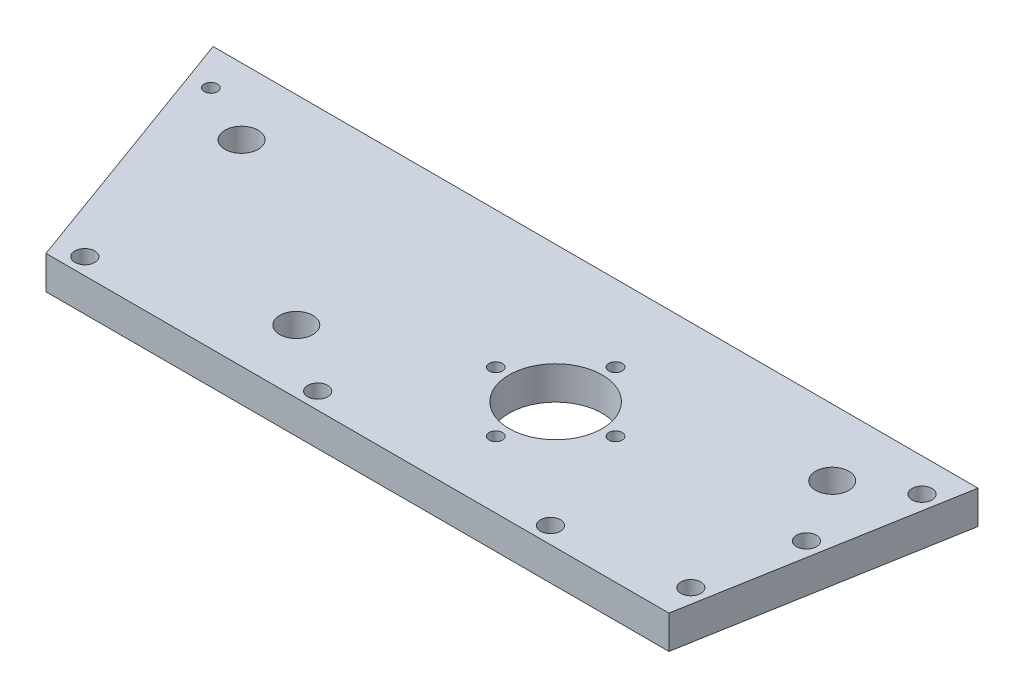
ISO-10303-21;
HEADER;
FILE_DESCRIPTION(('STEP AP214'),'2;1');
FILE_NAME('part.step','',(''),(''),'','','');
FILE_SCHEMA(('AUTOMOTIVE_DESIGN { 1 0 10303 214 1 1 1 1 }'));
ENDSEC;
DATA;
#1=APPLICATION_CONTEXT('core data for automotive mechanical design processes');
#2=APPLICATION_PROTOCOL_DEFINITION('international standard','automotive_design',2000,#1);
#3=PRODUCT_CONTEXT('',#1,'mechanical');
#4=PRODUCT('Part','Part','',(#3));
#5=PRODUCT_RELATED_PRODUCT_CATEGORY('part','',(#4));
#6=PRODUCT_DEFINITION_FORMATION('','',#4);
#7=PRODUCT_DEFINITION_CONTEXT('part definition',#1,'design');
#8=PRODUCT_DEFINITION('design','',#6,#7);
#9=PRODUCT_DEFINITION_SHAPE('','',#8);
#10=(LENGTH_UNIT() NAMED_UNIT(*) SI_UNIT(.MILLI.,.METRE.));
#11=(NAMED_UNIT(*) PLANE_ANGLE_UNIT() SI_UNIT($,.RADIAN.));
#12=(NAMED_UNIT(*) SI_UNIT($,.STERADIAN.) SOLID_ANGLE_UNIT());
#13=UNCERTAINTY_MEASURE_WITH_UNIT(LENGTH_MEASURE(1.E-05),#10,'distance_accuracy_value','');
#14=(GEOMETRIC_REPRESENTATION_CONTEXT(3) GLOBAL_UNCERTAINTY_ASSIGNED_CONTEXT((#13)) GLOBAL_UNIT_ASSIGNED_CONTEXT((#10,
#11,#12)) REPRESENTATION_CONTEXT('',''));
#15=CARTESIAN_POINT('',(0.,0.,0.));
#16=DIRECTION('',(0.,0.,1.));
#17=DIRECTION('',(1.,0.,0.));
#18=AXIS2_PLACEMENT_3D('',#15,#16,#17);
#19=CARTESIAN_POINT('',(0.,5.,-13.));
#20=DIRECTION('',(0.,0.,-1.));
#21=DIRECTION('',(-1.,0.,0.));
#22=AXIS2_PLACEMENT_3D('',#19,#20,#21);
#23=PLANE('',#22);
#24=DIRECTION('',(1.,0.,0.));
#25=VECTOR('',#24,1.);
#26=CARTESIAN_POINT('',(0.,0.,-13.));
#27=LINE('',#26,#25);
#28=CARTESIAN_POINT('',(-28.1321221673295,0.,-13.));
#29=VERTEX_POINT('',#28);
#30=CARTESIAN_POINT('',(65.5261378411708,0.,-13.));
#31=VERTEX_POINT('',#30);
#32=EDGE_CURVE('E114',#29,#31,#27,.T.);
#33=ORIENTED_EDGE('',*,*,#32,.T.);
#34=DIRECTION('',(0.,-1.,0.));
#35=VECTOR('',#34,1.);
#36=CARTESIAN_POINT('',(65.5261378411708,5.,-13.));
#37=LINE('',#36,#35);
#38=CARTESIAN_POINT('',(65.5261378411708,5.,-13.));
#39=VERTEX_POINT('',#38);
#40=EDGE_CURVE('E11',#39,#31,#37,.T.);
#41=ORIENTED_EDGE('',*,*,#40,.F.);
#42=DIRECTION('',(1.,0.,0.));
#43=VECTOR('',#42,1.);
#44=CARTESIAN_POINT('',(0.,5.,-13.));
#45=LINE('',#44,#43);
#46=CARTESIAN_POINT('',(-28.1321221673295,5.,-13.));
#47=VERTEX_POINT('',#46);
#48=EDGE_CURVE('E98',#47,#39,#45,.T.);
#49=ORIENTED_EDGE('',*,*,#48,.F.);
#50=DIRECTION('',(0.,-1.,0.));
#51=VECTOR('',#50,1.);
#52=CARTESIAN_POINT('',(-28.1321221673295,5.,-13.));
#53=LINE('',#52,#51);
#54=EDGE_CURVE('E110',#47,#29,#53,.T.);
#55=ORIENTED_EDGE('',*,*,#54,.T.);
#56=EDGE_LOOP('',(#33,#41,#49,#55));
#57=FACE_BOUND('',#56,.T.);
#58=ADVANCED_FACE('F46',(#57),#23,.F.);
#59=CARTESIAN_POINT('',(61.3271520879427,5.,10.813631563116));
#60=DIRECTION('',(-0.984807753012207,0.,-0.173648177666934));
#61=DIRECTION('',(-0.173648177666934,0.,0.984807753012207));
#62=AXIS2_PLACEMENT_3D('',#59,#60,#61);
#63=PLANE('',#62);
#64=DIRECTION('',(0.173648177666935,0.,-0.984807753012207));
#65=VECTOR('',#64,1.);
#66=CARTESIAN_POINT('',(61.3271520879427,0.,10.813631563116));
#67=LINE('',#66,#65);
#68=CARTESIAN_POINT('',(72.4910535791554,0.,-52.5));
#69=VERTEX_POINT('',#68);
#70=EDGE_CURVE('E103',#31,#69,#67,.T.);
#71=ORIENTED_EDGE('',*,*,#70,.T.);
#72=DIRECTION('',(0.,-1.,0.));
#73=VECTOR('',#72,1.);
#74=CARTESIAN_POINT('',(72.4910535791554,5.,-52.5));
#75=LINE('',#74,#73);
#76=CARTESIAN_POINT('',(72.4910535791554,5.,-52.5));
#77=VERTEX_POINT('',#76);
#78=EDGE_CURVE('E55',#77,#69,#75,.T.);
#79=ORIENTED_EDGE('',*,*,#78,.F.);
#80=DIRECTION('',(0.173648177666935,0.,-0.984807753012207));
#81=VECTOR('',#80,1.);
#82=CARTESIAN_POINT('',(61.3271520879427,5.,10.813631563116));
#83=LINE('',#82,#81);
#84=EDGE_CURVE('E93',#39,#77,#83,.T.);
#85=ORIENTED_EDGE('',*,*,#84,.F.);
#86=ORIENTED_EDGE('',*,*,#40,.T.);
#87=EDGE_LOOP('',(#71,#79,#85,#86));
#88=FACE_BOUND('',#87,.T.);
#89=ADVANCED_FACE('F102',(#88),#63,.F.);
#90=CARTESIAN_POINT('',(0.,5.,-52.5));
#91=DIRECTION('',(0.,0.,1.));
#92=DIRECTION('',(1.,0.,0.));
#93=AXIS2_PLACEMENT_3D('',#90,#91,#92);
#94=PLANE('',#93);
#95=DIRECTION('',(-1.,0.,0.));
#96=VECTOR('',#95,1.);
#97=CARTESIAN_POINT('',(0.,0.,-52.5));
#98=LINE('',#97,#96);
#99=CARTESIAN_POINT('',(-42.5089464208447,0.,-52.5));
#100=VERTEX_POINT('',#99);
#101=EDGE_CURVE('E80',#69,#100,#98,.T.);
#102=ORIENTED_EDGE('',*,*,#101,.T.);
#103=DIRECTION('',(0.,-1.,0.));
#104=VECTOR('',#103,1.);
#105=CARTESIAN_POINT('',(-42.5089464208447,5.,-52.5));
#106=LINE('',#105,#104);
#107=CARTESIAN_POINT('',(-42.5089464208447,5.,-52.5));
#108=VERTEX_POINT('',#107);
#109=EDGE_CURVE('E105',#108,#100,#106,.T.);
#110=ORIENTED_EDGE('',*,*,#109,.F.);
#111=DIRECTION('',(-1.,0.,0.));
#112=VECTOR('',#111,1.);
#113=CARTESIAN_POINT('',(0.,5.,-52.5));
#114=LINE('',#113,#112);
#115=EDGE_CURVE('E96',#77,#108,#114,.T.);
#116=ORIENTED_EDGE('',*,*,#115,.F.);
#117=ORIENTED_EDGE('',*,*,#78,.T.);
#118=EDGE_LOOP('',(#102,#110,#116,#117));
#119=FACE_BOUND('',#118,.T.);
#120=ADVANCED_FACE('F106',(#119),#94,.F.);
#121=CARTESIAN_POINT('',(-20.6631695504156,5.,7.52077866194712));
#122=DIRECTION('',(0.939692620785907,0.,-0.342020143325673));
#123=DIRECTION('',(-0.342020143325673,0.,-0.939692620785907));
#124=AXIS2_PLACEMENT_3D('',#121,#122,#123);
#125=PLANE('',#124);
#126=DIRECTION('',(0.342020143325673,0.,0.939692620785907));
#127=VECTOR('',#126,1.);
#128=CARTESIAN_POINT('',(-20.6631695504156,0.,7.52077866194712));
#129=LINE('',#128,#127);
#130=EDGE_CURVE('E86',#100,#29,#129,.T.);
#131=ORIENTED_EDGE('',*,*,#130,.T.);
#132=ORIENTED_EDGE('',*,*,#54,.F.);
#133=DIRECTION('',(0.342020143325673,0.,0.939692620785907));
#134=VECTOR('',#133,1.);
#135=CARTESIAN_POINT('',(-20.6631695504156,5.,7.52077866194712));
#136=LINE('',#135,#134);
#137=EDGE_CURVE('E63',#108,#47,#136,.T.);
#138=ORIENTED_EDGE('',*,*,#137,.F.);
#139=ORIENTED_EDGE('',*,*,#109,.T.);
#140=EDGE_LOOP('',(#131,#132,#138,#139));
#141=FACE_BOUND('',#140,.T.);
#142=ADVANCED_FACE('F128',(#141),#125,.F.);
#143=CARTESIAN_POINT('',(0.,5.,0.));
#144=DIRECTION('',(0.,1.,0.));
#145=DIRECTION('',(0.,0.,1.));
#146=AXIS2_PLACEMENT_3D('',#143,#144,#145);
#147=PLANE('',#146);
#148=CARTESIAN_POINT('',(-37.2957275552078,5.,-46.9482120844756));
#149=DIRECTION('',(0.,1.,0.));
#150=DIRECTION('',(0.,0.,1.));
#151=AXIS2_PLACEMENT_3D('',#148,#149,#150);
#152=CIRCLE('',#151,0.999999999999998);
#153=CARTESIAN_POINT('',(-37.2957275552078,5.,-45.9482120844756));
#154=VERTEX_POINT('',#153);
#155=EDGE_CURVE('E247',#154,#154,#152,.T.);
#156=ORIENTED_EDGE('',*,*,#155,.F.);
#157=EDGE_LOOP('',(#156));
#158=FACE_BOUND('',#157,.T.);
#159=CARTESIAN_POINT('',(-24.7853366630913,5.,-15.5));
#160=DIRECTION('',(0.,-1.,0.));
#161=DIRECTION('',(0.,0.,-1.));
#162=AXIS2_PLACEMENT_3D('',#159,#160,#161);
#163=CIRCLE('',#162,1.5);
#164=CARTESIAN_POINT('',(-24.7853366630913,5.,-17.));
#165=VERTEX_POINT('',#164);
#166=EDGE_CURVE('E188',#165,#165,#163,.T.);
#167=ORIENTED_EDGE('',*,*,#166,.T.);
#168=EDGE_LOOP('',(#167));
#169=FACE_BOUND('',#168,.T.);
#170=CARTESIAN_POINT('',(10.2146633369087,5.,-15.5));
#171=DIRECTION('',(0.,-1.,0.));
#172=DIRECTION('',(0.,0.,-1.));
#173=AXIS2_PLACEMENT_3D('',#170,#171,#172);
#174=CIRCLE('',#173,1.5);
#175=CARTESIAN_POINT('',(10.2146633369087,5.,-17.));
#176=VERTEX_POINT('',#175);
#177=EDGE_CURVE('E236',#176,#176,#174,.T.);
#178=ORIENTED_EDGE('',*,*,#177,.T.);
#179=EDGE_LOOP('',(#178));
#180=FACE_BOUND('',#179,.T.);
#181=CARTESIAN_POINT('',(45.2146633369087,5.,-15.5));
#182=DIRECTION('',(0.,-1.,0.));
#183=DIRECTION('',(0.,0.,-1.));
#184=AXIS2_PLACEMENT_3D('',#181,#182,#183);
#185=CIRCLE('',#184,1.5);
#186=CARTESIAN_POINT('',(45.2146633369087,5.,-17.));
#187=VERTEX_POINT('',#186);
#188=EDGE_CURVE('E228',#187,#187,#185,.T.);
#189=ORIENTED_EDGE('',*,*,#188,.T.);
#190=EDGE_LOOP('',(#189));
#191=FACE_BOUND('',#190,.T.);
#192=CARTESIAN_POINT('',(63.8614068158906,5.,-17.9557674096338));
#193=DIRECTION('',(0.,-1.,0.));
#194=DIRECTION('',(0.,0.,-1.));
#195=AXIS2_PLACEMENT_3D('',#192,#193,#194);
#196=CIRCLE('',#195,1.5);
#197=CARTESIAN_POINT('',(63.8614068158906,5.,-19.4557674096338));
#198=VERTEX_POINT('',#197);
#199=EDGE_CURVE('E220',#198,#198,#196,.T.);
#200=ORIENTED_EDGE('',*,*,#199,.T.);
#201=EDGE_LOOP('',(#200));
#202=FACE_BOUND('',#201,.T.);
#203=CARTESIAN_POINT('',(66.4661294808946,5.,-32.7278837048169));
#204=DIRECTION('',(0.,-1.,0.));
#205=DIRECTION('',(0.,0.,-1.));
#206=AXIS2_PLACEMENT_3D('',#203,#204,#205);
#207=CIRCLE('',#206,1.5);
#208=CARTESIAN_POINT('',(66.4661294808946,5.,-34.2278837048169));
#209=VERTEX_POINT('',#208);
#210=EDGE_CURVE('E212',#209,#209,#207,.T.);
#211=ORIENTED_EDGE('',*,*,#210,.T.);
#212=EDGE_LOOP('',(#211));
#213=FACE_BOUND('',#212,.T.);
#214=CARTESIAN_POINT('',(69.0708521458987,5.,-47.5));
#215=DIRECTION('',(0.,-1.,0.));
#216=DIRECTION('',(0.,0.,-1.));
#217=AXIS2_PLACEMENT_3D('',#214,#215,#216);
#218=CIRCLE('',#217,1.5);
#219=CARTESIAN_POINT('',(69.0708521458987,5.,-49.));
#220=VERTEX_POINT('',#219);
#221=EDGE_CURVE('E203',#220,#220,#218,.T.);
#222=ORIENTED_EDGE('',*,*,#221,.T.);
#223=EDGE_LOOP('',(#222));
#224=FACE_BOUND('',#223,.T.);
#225=CARTESIAN_POINT('',(20.4910535791554,5.,-32.));
#226=DIRECTION('',(0.,1.,0.));
#227=DIRECTION('',(0.,0.,1.));
#228=AXIS2_PLACEMENT_3D('',#225,#226,#227);
#229=CIRCLE('',#228,1.);
#230=CARTESIAN_POINT('',(20.4910535791554,5.,-31.));
#231=VERTEX_POINT('',#230);
#232=EDGE_CURVE('E163',#231,#231,#229,.T.);
#233=ORIENTED_EDGE('',*,*,#232,.F.);
#234=EDGE_LOOP('',(#233));
#235=FACE_BOUND('',#234,.T.);
#236=CARTESIAN_POINT('',(29.4910535791554,5.,-41.));
#237=DIRECTION('',(0.,1.,0.));
#238=DIRECTION('',(0.,0.,1.));
#239=AXIS2_PLACEMENT_3D('',#236,#237,#238);
#240=CIRCLE('',#239,1.);
#241=CARTESIAN_POINT('',(29.4910535791554,5.,-40.));
#242=VERTEX_POINT('',#241);
#243=EDGE_CURVE('E171',#242,#242,#240,.T.);
#244=ORIENTED_EDGE('',*,*,#243,.F.);
#245=EDGE_LOOP('',(#244));
#246=FACE_BOUND('',#245,.T.);
#247=CARTESIAN_POINT('',(38.4910535791554,5.,-32.));
#248=DIRECTION('',(0.,1.,0.));
#249=DIRECTION('',(0.,0.,1.));
#250=AXIS2_PLACEMENT_3D('',#247,#248,#249);
#251=CIRCLE('',#250,0.999999999999998);
#252=CARTESIAN_POINT('',(38.4910535791554,5.,-31.));
#253=VERTEX_POINT('',#252);
#254=EDGE_CURVE('E172',#253,#253,#251,.T.);
#255=ORIENTED_EDGE('',*,*,#254,.F.);
#256=EDGE_LOOP('',(#255));
#257=FACE_BOUND('',#256,.T.);
#258=CARTESIAN_POINT('',(29.4910535791554,5.,-23.));
#259=DIRECTION('',(0.,1.,0.));
#260=DIRECTION('',(0.,0.,1.));
#261=AXIS2_PLACEMENT_3D('',#258,#259,#260);
#262=CIRCLE('',#261,1.);
#263=CARTESIAN_POINT('',(29.4910535791554,5.,-22.));
#264=VERTEX_POINT('',#263);
#265=EDGE_CURVE('E187',#264,#264,#262,.T.);
#266=ORIENTED_EDGE('',*,*,#265,.F.);
#267=EDGE_LOOP('',(#266));
#268=FACE_BOUND('',#267,.T.);
#269=CARTESIAN_POINT('',(29.4910535791554,5.,-32.));
#270=DIRECTION('',(0.,1.,0.));
#271=DIRECTION('',(0.,0.,1.));
#272=AXIS2_PLACEMENT_3D('',#269,#270,#271);
#273=CIRCLE('',#272,7.00000000000004);
#274=CARTESIAN_POINT('',(29.4910535791554,5.,-25.));
#275=VERTEX_POINT('',#274);
#276=EDGE_CURVE('E159',#275,#275,#273,.T.);
#277=ORIENTED_EDGE('',*,*,#276,.F.);
#278=EDGE_LOOP('',(#277));
#279=FACE_BOUND('',#278,.T.);
#280=CARTESIAN_POINT('',(60.5735176532132,5.,-42.5));
#281=DIRECTION('',(0.,1.,0.));
#282=DIRECTION('',(0.,0.,1.));
#283=AXIS2_PLACEMENT_3D('',#280,#281,#282);
#284=CIRCLE('',#283,2.5);
#285=CARTESIAN_POINT('',(60.5735176532132,5.,-40.));
#286=VERTEX_POINT('',#285);
#287=EDGE_CURVE('E152',#286,#286,#284,.T.);
#288=ORIENTED_EDGE('',*,*,#287,.F.);
#289=EDGE_LOOP('',(#288));
#290=FACE_BOUND('',#289,.T.);
#291=CARTESIAN_POINT('',(0.,5.,-22.5));
#292=DIRECTION('',(0.,1.,0.));
#293=DIRECTION('',(0.,0.,1.));
#294=AXIS2_PLACEMENT_3D('',#291,#292,#293);
#295=CIRCLE('',#294,2.5);
#296=CARTESIAN_POINT('',(0.,5.,-20.));
#297=VERTEX_POINT('',#296);
#298=EDGE_CURVE('E148',#297,#297,#295,.T.);
#299=ORIENTED_EDGE('',*,*,#298,.F.);
#300=EDGE_LOOP('',(#299));
#301=FACE_BOUND('',#300,.T.);
#302=CARTESIAN_POINT('',(-28.2274663534234,5.,-42.5));
#303=DIRECTION('',(0.,1.,0.));
#304=DIRECTION('',(0.,0.,1.));
#305=AXIS2_PLACEMENT_3D('',#302,#303,#304);
#306=CIRCLE('',#305,2.5);
#307=CARTESIAN_POINT('',(-28.2274663534234,5.,-40.));
#308=VERTEX_POINT('',#307);
#309=EDGE_CURVE('E139',#308,#308,#306,.T.);
#310=ORIENTED_EDGE('',*,*,#309,.F.);
#311=EDGE_LOOP('',(#310));
#312=FACE_BOUND('',#311,.T.);
#313=ORIENTED_EDGE('',*,*,#48,.T.);
#314=ORIENTED_EDGE('',*,*,#84,.T.);
#315=ORIENTED_EDGE('',*,*,#115,.T.);
#316=ORIENTED_EDGE('',*,*,#137,.T.);
#317=EDGE_LOOP('',(#313,#314,#315,#316));
#318=FACE_BOUND('',#317,.T.);
#319=ADVANCED_FACE('F94',(#158,#169,#180,#191,#202,#213,#224,#235,#246,#257,#268,#279,#290,#301,
#312,#318),#147,.T.);
#320=CARTESIAN_POINT('',(0.,0.,0.));
#321=DIRECTION('',(0.,1.,0.));
#322=DIRECTION('',(0.,0.,1.));
#323=AXIS2_PLACEMENT_3D('',#320,#321,#322);
#324=PLANE('',#323);
#325=CARTESIAN_POINT('',(-37.2957275552078,0.,-46.9482120844756));
#326=DIRECTION('',(0.,1.,0.));
#327=DIRECTION('',(0.,0.,1.));
#328=AXIS2_PLACEMENT_3D('',#325,#326,#327);
#329=CIRCLE('',#328,0.999999999999998);
#330=CARTESIAN_POINT('',(-37.2957275552078,0.,-45.9482120844756));
#331=VERTEX_POINT('',#330);
#332=EDGE_CURVE('E204',#331,#331,#329,.T.);
#333=ORIENTED_EDGE('',*,*,#332,.T.);
#334=EDGE_LOOP('',(#333));
#335=FACE_BOUND('',#334,.T.);
#336=CARTESIAN_POINT('',(-24.7853366630913,0.,-15.5));
#337=DIRECTION('',(0.,-1.,0.));
#338=DIRECTION('',(0.,0.,-1.));
#339=AXIS2_PLACEMENT_3D('',#336,#337,#338);
#340=CIRCLE('',#339,1.5);
#341=CARTESIAN_POINT('',(-24.7853366630913,0.,-17.));
#342=VERTEX_POINT('',#341);
#343=EDGE_CURVE('E240',#342,#342,#340,.T.);
#344=ORIENTED_EDGE('',*,*,#343,.F.);
#345=EDGE_LOOP('',(#344));
#346=FACE_BOUND('',#345,.T.);
#347=CARTESIAN_POINT('',(10.2146633369087,0.,-15.5));
#348=DIRECTION('',(0.,-1.,0.));
#349=DIRECTION('',(0.,0.,-1.));
#350=AXIS2_PLACEMENT_3D('',#347,#348,#349);
#351=CIRCLE('',#350,1.5);
#352=CARTESIAN_POINT('',(10.2146633369087,0.,-17.));
#353=VERTEX_POINT('',#352);
#354=EDGE_CURVE('E232',#353,#353,#351,.T.);
#355=ORIENTED_EDGE('',*,*,#354,.F.);
#356=EDGE_LOOP('',(#355));
#357=FACE_BOUND('',#356,.T.);
#358=CARTESIAN_POINT('',(45.2146633369087,0.,-15.5));
#359=DIRECTION('',(0.,-1.,0.));
#360=DIRECTION('',(0.,0.,-1.));
#361=AXIS2_PLACEMENT_3D('',#358,#359,#360);
#362=CIRCLE('',#361,1.5);
#363=CARTESIAN_POINT('',(45.2146633369087,0.,-17.));
#364=VERTEX_POINT('',#363);
#365=EDGE_CURVE('E224',#364,#364,#362,.T.);
#366=ORIENTED_EDGE('',*,*,#365,.F.);
#367=EDGE_LOOP('',(#366));
#368=FACE_BOUND('',#367,.T.);
#369=CARTESIAN_POINT('',(63.8614068158906,0.,-17.9557674096338));
#370=DIRECTION('',(0.,-1.,0.));
#371=DIRECTION('',(0.,0.,-1.));
#372=AXIS2_PLACEMENT_3D('',#369,#370,#371);
#373=CIRCLE('',#372,1.5);
#374=CARTESIAN_POINT('',(63.8614068158906,0.,-19.4557674096338));
#375=VERTEX_POINT('',#374);
#376=EDGE_CURVE('E216',#375,#375,#373,.T.);
#377=ORIENTED_EDGE('',*,*,#376,.F.);
#378=EDGE_LOOP('',(#377));
#379=FACE_BOUND('',#378,.T.);
#380=CARTESIAN_POINT('',(66.4661294808946,0.,-32.7278837048169));
#381=DIRECTION('',(0.,-1.,0.));
#382=DIRECTION('',(0.,0.,-1.));
#383=AXIS2_PLACEMENT_3D('',#380,#381,#382);
#384=CIRCLE('',#383,1.5);
#385=CARTESIAN_POINT('',(66.4661294808946,0.,-34.2278837048169));
#386=VERTEX_POINT('',#385);
#387=EDGE_CURVE('E208',#386,#386,#384,.T.);
#388=ORIENTED_EDGE('',*,*,#387,.F.);
#389=EDGE_LOOP('',(#388));
#390=FACE_BOUND('',#389,.T.);
#391=CARTESIAN_POINT('',(69.0708521458987,0.,-47.5));
#392=DIRECTION('',(0.,-1.,0.));
#393=DIRECTION('',(0.,0.,-1.));
#394=AXIS2_PLACEMENT_3D('',#391,#392,#393);
#395=CIRCLE('',#394,1.5);
#396=CARTESIAN_POINT('',(69.0708521458987,0.,-49.));
#397=VERTEX_POINT('',#396);
#398=EDGE_CURVE('E199',#397,#397,#395,.T.);
#399=ORIENTED_EDGE('',*,*,#398,.F.);
#400=EDGE_LOOP('',(#399));
#401=FACE_BOUND('',#400,.T.);
#402=CARTESIAN_POINT('',(20.4910535791554,0.,-32.));
#403=DIRECTION('',(0.,1.,0.));
#404=DIRECTION('',(0.,0.,1.));
#405=AXIS2_PLACEMENT_3D('',#402,#403,#404);
#406=CIRCLE('',#405,1.);
#407=CARTESIAN_POINT('',(20.4910535791554,0.,-31.));
#408=VERTEX_POINT('',#407);
#409=EDGE_CURVE('E176',#408,#408,#406,.T.);
#410=ORIENTED_EDGE('',*,*,#409,.T.);
#411=EDGE_LOOP('',(#410));
#412=FACE_BOUND('',#411,.T.);
#413=CARTESIAN_POINT('',(29.4910535791554,0.,-41.));
#414=DIRECTION('',(0.,1.,0.));
#415=DIRECTION('',(0.,0.,1.));
#416=AXIS2_PLACEMENT_3D('',#413,#414,#415);
#417=CIRCLE('',#416,1.);
#418=CARTESIAN_POINT('',(29.4910535791554,0.,-40.));
#419=VERTEX_POINT('',#418);
#420=EDGE_CURVE('E167',#419,#419,#417,.T.);
#421=ORIENTED_EDGE('',*,*,#420,.T.);
#422=EDGE_LOOP('',(#421));
#423=FACE_BOUND('',#422,.T.);
#424=CARTESIAN_POINT('',(38.4910535791554,0.,-32.));
#425=DIRECTION('',(0.,1.,0.));
#426=DIRECTION('',(0.,0.,1.));
#427=AXIS2_PLACEMENT_3D('',#424,#425,#426);
#428=CIRCLE('',#427,0.999999999999998);
#429=CARTESIAN_POINT('',(38.4910535791554,0.,-31.));
#430=VERTEX_POINT('',#429);
#431=EDGE_CURVE('E192',#430,#430,#428,.T.);
#432=ORIENTED_EDGE('',*,*,#431,.T.);
#433=EDGE_LOOP('',(#432));
#434=FACE_BOUND('',#433,.T.);
#435=CARTESIAN_POINT('',(29.4910535791554,0.,-23.));
#436=DIRECTION('',(0.,1.,0.));
#437=DIRECTION('',(0.,0.,1.));
#438=AXIS2_PLACEMENT_3D('',#435,#436,#437);
#439=CIRCLE('',#438,1.);
#440=CARTESIAN_POINT('',(29.4910535791554,0.,-22.));
#441=VERTEX_POINT('',#440);
#442=EDGE_CURVE('E183',#441,#441,#439,.T.);
#443=ORIENTED_EDGE('',*,*,#442,.T.);
#444=EDGE_LOOP('',(#443));
#445=FACE_BOUND('',#444,.T.);
#446=CARTESIAN_POINT('',(29.4910535791554,0.,-32.));
#447=DIRECTION('',(0.,1.,0.));
#448=DIRECTION('',(0.,0.,1.));
#449=AXIS2_PLACEMENT_3D('',#446,#447,#448);
#450=CIRCLE('',#449,7.00000000000004);
#451=CARTESIAN_POINT('',(29.4910535791554,0.,-25.));
#452=VERTEX_POINT('',#451);
#453=EDGE_CURVE('E140',#452,#452,#450,.T.);
#454=ORIENTED_EDGE('',*,*,#453,.T.);
#455=EDGE_LOOP('',(#454));
#456=FACE_BOUND('',#455,.T.);
#457=CARTESIAN_POINT('',(60.5735176532132,0.,-42.5));
#458=DIRECTION('',(0.,1.,0.));
#459=DIRECTION('',(0.,0.,1.));
#460=AXIS2_PLACEMENT_3D('',#457,#458,#459);
#461=CIRCLE('',#460,2.5);
#462=CARTESIAN_POINT('',(60.5735176532132,0.,-40.));
#463=VERTEX_POINT('',#462);
#464=EDGE_CURVE('E118',#463,#463,#461,.T.);
#465=ORIENTED_EDGE('',*,*,#464,.T.);
#466=EDGE_LOOP('',(#465));
#467=FACE_BOUND('',#466,.T.);
#468=CARTESIAN_POINT('',(0.,0.,-22.5));
#469=DIRECTION('',(0.,1.,0.));
#470=DIRECTION('',(0.,0.,1.));
#471=AXIS2_PLACEMENT_3D('',#468,#469,#470);
#472=CIRCLE('',#471,2.5);
#473=CARTESIAN_POINT('',(0.,0.,-20.));
#474=VERTEX_POINT('',#473);
#475=EDGE_CURVE('E144',#474,#474,#472,.T.);
#476=ORIENTED_EDGE('',*,*,#475,.T.);
#477=EDGE_LOOP('',(#476));
#478=FACE_BOUND('',#477,.T.);
#479=CARTESIAN_POINT('',(-28.2274663534234,0.,-42.5));
#480=DIRECTION('',(0.,1.,0.));
#481=DIRECTION('',(0.,0.,1.));
#482=AXIS2_PLACEMENT_3D('',#479,#480,#481);
#483=CIRCLE('',#482,2.5);
#484=CARTESIAN_POINT('',(-28.2274663534234,0.,-40.));
#485=VERTEX_POINT('',#484);
#486=EDGE_CURVE('E135',#485,#485,#483,.T.);
#487=ORIENTED_EDGE('',*,*,#486,.T.);
#488=EDGE_LOOP('',(#487));
#489=FACE_BOUND('',#488,.T.);
#490=ORIENTED_EDGE('',*,*,#32,.F.);
#491=ORIENTED_EDGE('',*,*,#130,.F.);
#492=ORIENTED_EDGE('',*,*,#101,.F.);
#493=ORIENTED_EDGE('',*,*,#70,.F.);
#494=EDGE_LOOP('',(#490,#491,#492,#493));
#495=FACE_BOUND('',#494,.T.);
#496=ADVANCED_FACE('F131',(#335,#346,#357,#368,#379,#390,#401,#412,#423,#434,#445,#456,#467,
#478,#489,#495),#324,.F.);
#497=CARTESIAN_POINT('',(-28.2274663534234,0.,-42.5));
#498=DIRECTION('',(0.,1.,0.));
#499=DIRECTION('',(0.,0.,1.));
#500=AXIS2_PLACEMENT_3D('',#497,#498,#499);
#501=CYLINDRICAL_SURFACE('',#500,2.5);
#502=ORIENTED_EDGE('',*,*,#486,.F.);
#503=EDGE_LOOP('',(#502));
#504=FACE_BOUND('',#503,.T.);
#505=ORIENTED_EDGE('',*,*,#309,.T.);
#506=EDGE_LOOP('',(#505));
#507=FACE_BOUND('',#506,.T.);
#508=ADVANCED_FACE('F295',(#504,#507),#501,.F.);
#509=CARTESIAN_POINT('',(0.,0.,-22.5));
#510=DIRECTION('',(0.,1.,0.));
#511=DIRECTION('',(0.,0.,1.));
#512=AXIS2_PLACEMENT_3D('',#509,#510,#511);
#513=CYLINDRICAL_SURFACE('',#512,2.5);
#514=ORIENTED_EDGE('',*,*,#475,.F.);
#515=EDGE_LOOP('',(#514));
#516=FACE_BOUND('',#515,.T.);
#517=ORIENTED_EDGE('',*,*,#298,.T.);
#518=EDGE_LOOP('',(#517));
#519=FACE_BOUND('',#518,.T.);
#520=ADVANCED_FACE('F297',(#516,#519),#513,.F.);
#521=CARTESIAN_POINT('',(60.5735176532132,0.,-42.5));
#522=DIRECTION('',(0.,1.,0.));
#523=DIRECTION('',(0.,0.,1.));
#524=AXIS2_PLACEMENT_3D('',#521,#522,#523);
#525=CYLINDRICAL_SURFACE('',#524,2.5);
#526=ORIENTED_EDGE('',*,*,#464,.F.);
#527=EDGE_LOOP('',(#526));
#528=FACE_BOUND('',#527,.T.);
#529=ORIENTED_EDGE('',*,*,#287,.T.);
#530=EDGE_LOOP('',(#529));
#531=FACE_BOUND('',#530,.T.);
#532=ADVANCED_FACE('F304',(#528,#531),#525,.F.);
#533=CARTESIAN_POINT('',(29.4910535791554,0.,-32.));
#534=DIRECTION('',(0.,1.,0.));
#535=DIRECTION('',(0.,0.,1.));
#536=AXIS2_PLACEMENT_3D('',#533,#534,#535);
#537=CYLINDRICAL_SURFACE('',#536,7.00000000000004);
#538=ORIENTED_EDGE('',*,*,#453,.F.);
#539=EDGE_LOOP('',(#538));
#540=FACE_BOUND('',#539,.T.);
#541=ORIENTED_EDGE('',*,*,#276,.T.);
#542=EDGE_LOOP('',(#541));
#543=FACE_BOUND('',#542,.T.);
#544=ADVANCED_FACE('F363',(#540,#543),#537,.F.);
#545=CARTESIAN_POINT('',(29.4910535791554,0.,-23.));
#546=DIRECTION('',(0.,1.,0.));
#547=DIRECTION('',(0.,0.,1.));
#548=AXIS2_PLACEMENT_3D('',#545,#546,#547);
#549=CYLINDRICAL_SURFACE('',#548,1.);
#550=ORIENTED_EDGE('',*,*,#442,.F.);
#551=EDGE_LOOP('',(#550));
#552=FACE_BOUND('',#551,.T.);
#553=ORIENTED_EDGE('',*,*,#265,.T.);
#554=EDGE_LOOP('',(#553));
#555=FACE_BOUND('',#554,.T.);
#556=ADVANCED_FACE('F372',(#552,#555),#549,.F.);
#557=CARTESIAN_POINT('',(38.4910535791554,0.,-32.));
#558=DIRECTION('',(0.,1.,0.));
#559=DIRECTION('',(0.,0.,1.));
#560=AXIS2_PLACEMENT_3D('',#557,#558,#559);
#561=CYLINDRICAL_SURFACE('',#560,0.999999999999998);
#562=ORIENTED_EDGE('',*,*,#431,.F.);
#563=EDGE_LOOP('',(#562));
#564=FACE_BOUND('',#563,.T.);
#565=ORIENTED_EDGE('',*,*,#254,.T.);
#566=EDGE_LOOP('',(#565));
#567=FACE_BOUND('',#566,.T.);
#568=ADVANCED_FACE('F381',(#564,#567),#561,.F.);
#569=CARTESIAN_POINT('',(29.4910535791554,0.,-41.));
#570=DIRECTION('',(0.,1.,0.));
#571=DIRECTION('',(0.,0.,1.));
#572=AXIS2_PLACEMENT_3D('',#569,#570,#571);
#573=CYLINDRICAL_SURFACE('',#572,1.);
#574=ORIENTED_EDGE('',*,*,#420,.F.);
#575=EDGE_LOOP('',(#574));
#576=FACE_BOUND('',#575,.T.);
#577=ORIENTED_EDGE('',*,*,#243,.T.);
#578=EDGE_LOOP('',(#577));
#579=FACE_BOUND('',#578,.T.);
#580=ADVANCED_FACE('F390',(#576,#579),#573,.F.);
#581=CARTESIAN_POINT('',(20.4910535791554,0.,-32.));
#582=DIRECTION('',(0.,1.,0.));
#583=DIRECTION('',(0.,0.,1.));
#584=AXIS2_PLACEMENT_3D('',#581,#582,#583);
#585=CYLINDRICAL_SURFACE('',#584,1.);
#586=ORIENTED_EDGE('',*,*,#409,.F.);
#587=EDGE_LOOP('',(#586));
#588=FACE_BOUND('',#587,.T.);
#589=ORIENTED_EDGE('',*,*,#232,.T.);
#590=EDGE_LOOP('',(#589));
#591=FACE_BOUND('',#590,.T.);
#592=ADVANCED_FACE('F399',(#588,#591),#585,.F.);
#593=CARTESIAN_POINT('',(69.0708521458987,5.,-47.5));
#594=DIRECTION('',(0.,-1.,0.));
#595=DIRECTION('',(0.,0.,-1.));
#596=AXIS2_PLACEMENT_3D('',#593,#594,#595);
#597=CYLINDRICAL_SURFACE('',#596,1.5);
#598=ORIENTED_EDGE('',*,*,#221,.F.);
#599=EDGE_LOOP('',(#598));
#600=FACE_BOUND('',#599,.T.);
#601=ORIENTED_EDGE('',*,*,#398,.T.);
#602=EDGE_LOOP('',(#601));
#603=FACE_BOUND('',#602,.T.);
#604=ADVANCED_FACE('F408',(#600,#603),#597,.F.);
#605=CARTESIAN_POINT('',(66.4661294808946,5.,-32.7278837048169));
#606=DIRECTION('',(0.,-1.,0.));
#607=DIRECTION('',(0.,0.,-1.));
#608=AXIS2_PLACEMENT_3D('',#605,#606,#607);
#609=CYLINDRICAL_SURFACE('',#608,1.5);
#610=ORIENTED_EDGE('',*,*,#210,.F.);
#611=EDGE_LOOP('',(#610));
#612=FACE_BOUND('',#611,.T.);
#613=ORIENTED_EDGE('',*,*,#387,.T.);
#614=EDGE_LOOP('',(#613));
#615=FACE_BOUND('',#614,.T.);
#616=ADVANCED_FACE('F417',(#612,#615),#609,.F.);
#617=CARTESIAN_POINT('',(63.8614068158906,5.,-17.9557674096338));
#618=DIRECTION('',(0.,-1.,0.));
#619=DIRECTION('',(0.,0.,-1.));
#620=AXIS2_PLACEMENT_3D('',#617,#618,#619);
#621=CYLINDRICAL_SURFACE('',#620,1.5);
#622=ORIENTED_EDGE('',*,*,#199,.F.);
#623=EDGE_LOOP('',(#622));
#624=FACE_BOUND('',#623,.T.);
#625=ORIENTED_EDGE('',*,*,#376,.T.);
#626=EDGE_LOOP('',(#625));
#627=FACE_BOUND('',#626,.T.);
#628=ADVANCED_FACE('F426',(#624,#627),#621,.F.);
#629=CARTESIAN_POINT('',(45.2146633369087,5.,-15.5));
#630=DIRECTION('',(0.,-1.,0.));
#631=DIRECTION('',(0.,0.,-1.));
#632=AXIS2_PLACEMENT_3D('',#629,#630,#631);
#633=CYLINDRICAL_SURFACE('',#632,1.5);
#634=ORIENTED_EDGE('',*,*,#188,.F.);
#635=EDGE_LOOP('',(#634));
#636=FACE_BOUND('',#635,.T.);
#637=ORIENTED_EDGE('',*,*,#365,.T.);
#638=EDGE_LOOP('',(#637));
#639=FACE_BOUND('',#638,.T.);
#640=ADVANCED_FACE('F435',(#636,#639),#633,.F.);
#641=CARTESIAN_POINT('',(10.2146633369087,5.,-15.5));
#642=DIRECTION('',(0.,-1.,0.));
#643=DIRECTION('',(0.,0.,-1.));
#644=AXIS2_PLACEMENT_3D('',#641,#642,#643);
#645=CYLINDRICAL_SURFACE('',#644,1.5);
#646=ORIENTED_EDGE('',*,*,#177,.F.);
#647=EDGE_LOOP('',(#646));
#648=FACE_BOUND('',#647,.T.);
#649=ORIENTED_EDGE('',*,*,#354,.T.);
#650=EDGE_LOOP('',(#649));
#651=FACE_BOUND('',#650,.T.);
#652=ADVANCED_FACE('F444',(#648,#651),#645,.F.);
#653=CARTESIAN_POINT('',(-24.7853366630913,5.,-15.5));
#654=DIRECTION('',(0.,-1.,0.));
#655=DIRECTION('',(0.,0.,-1.));
#656=AXIS2_PLACEMENT_3D('',#653,#654,#655);
#657=CYLINDRICAL_SURFACE('',#656,1.5);
#658=ORIENTED_EDGE('',*,*,#166,.F.);
#659=EDGE_LOOP('',(#658));
#660=FACE_BOUND('',#659,.T.);
#661=ORIENTED_EDGE('',*,*,#343,.T.);
#662=EDGE_LOOP('',(#661));
#663=FACE_BOUND('',#662,.T.);
#664=ADVANCED_FACE('F260',(#660,#663),#657,.F.);
#665=CARTESIAN_POINT('',(-37.2957275552078,0.,-46.9482120844756));
#666=DIRECTION('',(0.,1.,0.));
#667=DIRECTION('',(0.,0.,1.));
#668=AXIS2_PLACEMENT_3D('',#665,#666,#667);
#669=CYLINDRICAL_SURFACE('',#668,0.999999999999998);
#670=ORIENTED_EDGE('',*,*,#332,.F.);
#671=EDGE_LOOP('',(#670));
#672=FACE_BOUND('',#671,.T.);
#673=ORIENTED_EDGE('',*,*,#155,.T.);
#674=EDGE_LOOP('',(#673));
#675=FACE_BOUND('',#674,.T.);
#676=ADVANCED_FACE('F257',(#672,#675),#669,.F.);
#677=CLOSED_SHELL('',(#58,#89,#120,#142,#319,#496,#508,#520,#532,#544,#556,#568,#580,#592,#604,
#616,#628,#640,#652,#664,#676));
#678=MANIFOLD_SOLID_BREP('B2',#677);
#679=ADVANCED_BREP_SHAPE_REPRESENTATION('',(#18,#678),#14);
#680=SHAPE_DEFINITION_REPRESENTATION(#9,#679);
ENDSEC;
END-ISO-10303-21;
